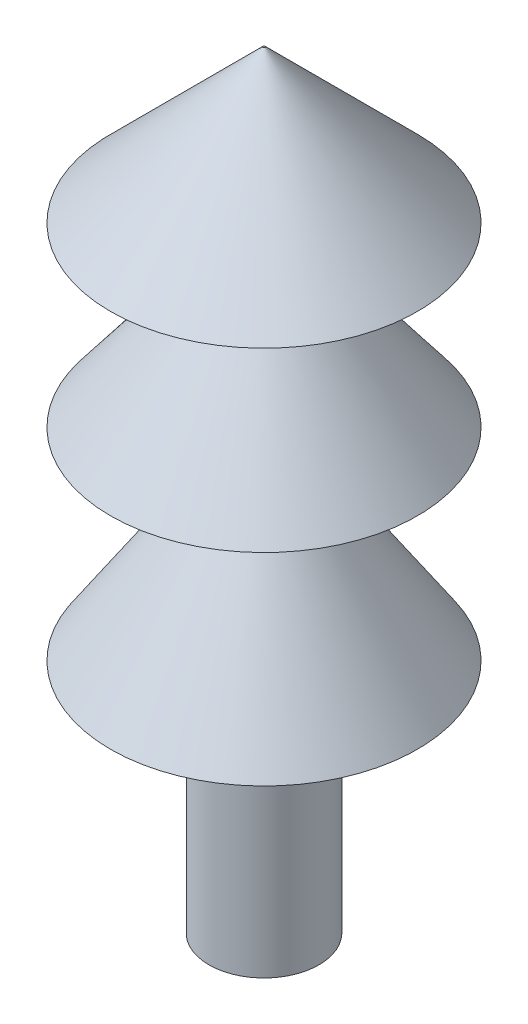
ISO-10303-21;
HEADER;
FILE_DESCRIPTION(('STEP AP214'),'2;1');
FILE_NAME('part.step','',(''),(''),'','','');
FILE_SCHEMA(('AUTOMOTIVE_DESIGN { 1 0 10303 214 1 1 1 1 }'));
ENDSEC;
DATA;
#1=APPLICATION_CONTEXT('core data for automotive mechanical design processes');
#2=APPLICATION_PROTOCOL_DEFINITION('international standard','automotive_design',2000,#1);
#3=PRODUCT_CONTEXT('',#1,'mechanical');
#4=PRODUCT('Part','Part','',(#3));
#5=PRODUCT_RELATED_PRODUCT_CATEGORY('part','',(#4));
#6=PRODUCT_DEFINITION_FORMATION('','',#4);
#7=PRODUCT_DEFINITION_CONTEXT('part definition',#1,'design');
#8=PRODUCT_DEFINITION('design','',#6,#7);
#9=PRODUCT_DEFINITION_SHAPE('','',#8);
#10=(LENGTH_UNIT() NAMED_UNIT(*) SI_UNIT(.MILLI.,.METRE.));
#11=(NAMED_UNIT(*) PLANE_ANGLE_UNIT() SI_UNIT($,.RADIAN.));
#12=(NAMED_UNIT(*) SI_UNIT($,.STERADIAN.) SOLID_ANGLE_UNIT());
#13=UNCERTAINTY_MEASURE_WITH_UNIT(LENGTH_MEASURE(1.E-05),#10,'distance_accuracy_value','');
#14=(GEOMETRIC_REPRESENTATION_CONTEXT(3) GLOBAL_UNCERTAINTY_ASSIGNED_CONTEXT((#13)) GLOBAL_UNIT_ASSIGNED_CONTEXT((#10,
#11,#12)) REPRESENTATION_CONTEXT('',''));
#15=CARTESIAN_POINT('',(0.,0.,0.));
#16=DIRECTION('',(0.,0.,1.));
#17=DIRECTION('',(1.,0.,0.));
#18=AXIS2_PLACEMENT_3D('',#15,#16,#17);
#19=CARTESIAN_POINT('',(0.,40.,0.));
#20=DIRECTION('',(0.,1.,0.));
#21=DIRECTION('',(0.,0.,1.));
#22=AXIS2_PLACEMENT_3D('',#19,#20,#21);
#23=CYLINDRICAL_SURFACE('',#22,2.86773925037495);
#24=CARTESIAN_POINT('',(0.,12.2957168686561,0.));
#25=DIRECTION('',(0.,1.,0.));
#26=DIRECTION('',(0.,0.,1.));
#27=AXIS2_PLACEMENT_3D('',#24,#25,#26);
#28=CIRCLE('',#27,2.86773925037495);
#29=CARTESIAN_POINT('',(0.,12.2957168686561,2.86773925037495));
#30=VERTEX_POINT('',#29);
#31=EDGE_CURVE('E40',#30,#30,#28,.T.);
#32=ORIENTED_EDGE('',*,*,#31,.F.);
#33=EDGE_LOOP('',(#32));
#34=FACE_BOUND('',#33,.T.);
#35=CARTESIAN_POINT('',(0.,0.,0.));
#36=DIRECTION('',(0.,1.,0.));
#37=DIRECTION('',(0.,0.,1.));
#38=AXIS2_PLACEMENT_3D('',#35,#36,#37);
#39=CIRCLE('',#38,2.86773925037495);
#40=CARTESIAN_POINT('',(0.,0.,2.86773925037495));
#41=VERTEX_POINT('',#40);
#42=EDGE_CURVE('E10',#41,#41,#39,.F.);
#43=ORIENTED_EDGE('',*,*,#42,.F.);
#44=EDGE_LOOP('',(#43));
#45=FACE_BOUND('',#44,.T.);
#46=ADVANCED_FACE('F33',(#34,#45),#23,.T.);
#47=CARTESIAN_POINT('',(0.,12.2957168686561,8.));
#48=DIRECTION('',(0.,1.,0.));
#49=DIRECTION('',(0.,0.,1.));
#50=AXIS2_PLACEMENT_3D('',#47,#48,#49);
#51=PLANE('',#50);
#52=CARTESIAN_POINT('',(0.,12.2957168686561,0.));
#53=DIRECTION('',(0.,1.,0.));
#54=DIRECTION('',(0.,0.,1.));
#55=AXIS2_PLACEMENT_3D('',#52,#53,#54);
#56=CIRCLE('',#55,8.);
#57=CARTESIAN_POINT('',(0.,12.2957168686561,-8.));
#58=VERTEX_POINT('',#57);
#59=EDGE_CURVE('E44',#58,#58,#56,.T.);
#60=ORIENTED_EDGE('',*,*,#59,.F.);
#61=EDGE_LOOP('',(#60));
#62=FACE_BOUND('',#61,.T.);
#63=ORIENTED_EDGE('',*,*,#31,.T.);
#64=EDGE_LOOP('',(#63));
#65=FACE_BOUND('',#64,.T.);
#66=ADVANCED_FACE('F95',(#62,#65),#51,.F.);
#67=CARTESIAN_POINT('',(0.,12.2957168686561,0.));
#68=DIRECTION('',(0.,-1.,0.));
#69=DIRECTION('',(0.,0.,-1.));
#70=AXIS2_PLACEMENT_3D('',#67,#68,#69);
#71=CONICAL_SURFACE('',#70,8.,0.590580734038986);
#72=CARTESIAN_POINT('',(0.,22.8328612799039,0.));
#73=DIRECTION('',(0.,1.,0.));
#74=DIRECTION('',(0.,0.,1.));
#75=AXIS2_PLACEMENT_3D('',#72,#73,#74);
#76=CIRCLE('',#75,0.93592944164618);
#77=CARTESIAN_POINT('',(0.,22.8328612799039,-0.935929441646179));
#78=VERTEX_POINT('',#77);
#79=EDGE_CURVE('E48',#78,#78,#76,.T.);
#80=CARTESIAN_POINT('',(0.,22.8328612799039,-0.935929441646179));
#81=CARTESIAN_POINT('',(0.,22.7230993589534,-1.00951350996237));
#82=CARTESIAN_POINT('',(0.,22.613337438003,-1.08309757827855));
#83=CARTESIAN_POINT('',(0.,22.3938135961019,-1.23026571491092));
#84=CARTESIAN_POINT('',(0.,22.2840516751515,-1.30384978322711));
#85=CARTESIAN_POINT('',(0.,22.0645278332505,-1.45101791985948));
#86=CARTESIAN_POINT('',(0.,21.9547659123,-1.52460198817566));
#87=CARTESIAN_POINT('',(0.,21.735242070399,-1.67177012480804));
#88=CARTESIAN_POINT('',(0.,21.6254801494485,-1.74535419312422));
#89=CARTESIAN_POINT('',(0.,21.4059563075475,-1.89252232975659));
#90=CARTESIAN_POINT('',(0.,21.296194386597,-1.96610639807278));
#91=CARTESIAN_POINT('',(0.,21.076670544696,-2.11327453470515));
#92=CARTESIAN_POINT('',(0.,20.9669086237455,-2.18685860302134));
#93=CARTESIAN_POINT('',(0.,20.7473847818445,-2.33402673965371));
#94=CARTESIAN_POINT('',(0.,20.637622860894,-2.40761080796989));
#95=CARTESIAN_POINT('',(0.,20.418099018993,-2.55477894460226));
#96=CARTESIAN_POINT('',(0.,20.3083370980425,-2.62836301291845));
#97=CARTESIAN_POINT('',(0.,20.0888132561415,-2.77553114955082));
#98=CARTESIAN_POINT('',(0.,19.979051335191,-2.84911521786701));
#99=CARTESIAN_POINT('',(0.,19.75952749329,-2.99628335449938));
#100=CARTESIAN_POINT('',(0.,19.6497655723395,-3.06986742281556));
#101=CARTESIAN_POINT('',(0.,19.4302417304385,-3.21703555944793));
#102=CARTESIAN_POINT('',(0.,19.320479809488,-3.29061962776412));
#103=CARTESIAN_POINT('',(0.,19.100955967587,-3.43778776439649));
#104=CARTESIAN_POINT('',(0.,18.9911940466365,-3.51137183271268));
#105=CARTESIAN_POINT('',(0.,18.7716702047355,-3.65853996934505));
#106=CARTESIAN_POINT('',(0.,18.661908283785,-3.73212403766123));
#107=CARTESIAN_POINT('',(0.,18.442384441884,-3.8792921742936));
#108=CARTESIAN_POINT('',(0.,18.3326225209335,-3.95287624260979));
#109=CARTESIAN_POINT('',(0.,18.1130986790325,-4.10004437924216));
#110=CARTESIAN_POINT('',(0.,18.003336758082,-4.17362844755835));
#111=CARTESIAN_POINT('',(0.,17.783812916181,-4.32079658419072));
#112=CARTESIAN_POINT('',(0.,17.6740509952305,-4.3943806525069));
#113=CARTESIAN_POINT('',(0.,17.4545271533295,-4.54154878913928));
#114=CARTESIAN_POINT('',(0.,17.344765232379,-4.61513285745546));
#115=CARTESIAN_POINT('',(0.,17.125241390478,-4.76230099408783));
#116=CARTESIAN_POINT('',(0.,17.0154794695275,-4.83588506240402));
#117=CARTESIAN_POINT('',(0.,16.7959556276265,-4.98305319903639));
#118=CARTESIAN_POINT('',(0.,16.686193706676,-5.05663726735258));
#119=CARTESIAN_POINT('',(0.,16.466669864775,-5.20380540398495));
#120=CARTESIAN_POINT('',(0.,16.3569079438245,-5.27738947230113));
#121=CARTESIAN_POINT('',(0.,16.1373841019235,-5.4245576089335));
#122=CARTESIAN_POINT('',(0.,16.027622180973,-5.49814167724969));
#123=CARTESIAN_POINT('',(0.,15.808098339072,-5.64530981388206));
#124=CARTESIAN_POINT('',(0.,15.6983364181215,-5.71889388219825));
#125=CARTESIAN_POINT('',(0.,15.4788125762205,-5.86606201883062));
#126=CARTESIAN_POINT('',(0.,15.36905065527,-5.9396460871468));
#127=CARTESIAN_POINT('',(0.,15.149526813369,-6.08681422377918));
#128=CARTESIAN_POINT('',(0.,15.0397648924185,-6.16039829209536));
#129=CARTESIAN_POINT('',(0.,14.8202410505175,-6.30756642872773));
#130=CARTESIAN_POINT('',(0.,14.710479129567,-6.38115049704392));
#131=CARTESIAN_POINT('',(0.,14.490955287666,-6.52831863367629));
#132=CARTESIAN_POINT('',(0.,14.3811933667155,-6.60190270199247));
#133=CARTESIAN_POINT('',(0.,14.1616695248145,-6.74907083862485));
#134=CARTESIAN_POINT('',(0.,14.051907603864,-6.82265490694103));
#135=CARTESIAN_POINT('',(0.,13.832383761963,-6.9698230435734));
#136=CARTESIAN_POINT('',(0.,13.7226218410125,-7.04340711188959));
#137=CARTESIAN_POINT('',(0.,13.5030979991115,-7.19057524852196));
#138=CARTESIAN_POINT('',(0.,13.393336078161,-7.26415931683814));
#139=CARTESIAN_POINT('',(0.,13.1738122362601,-7.41132745347052));
#140=CARTESIAN_POINT('',(0.,13.0640503153096,-7.4849115217867));
#141=CARTESIAN_POINT('',(0.,12.8445264734086,-7.63207965841907));
#142=CARTESIAN_POINT('',(0.,12.7347645524581,-7.70566372673526));
#143=CARTESIAN_POINT('',(0.,12.5152407105571,-7.85283186336763));
#144=CARTESIAN_POINT('',(0.,12.4054787896066,-7.92641593168382));
#145=CARTESIAN_POINT('',(0.,12.2957168686561,-8.));
#146=B_SPLINE_CURVE_WITH_KNOTS('',3,(#80,#81,#82,#83,#84,#85,#86,#87,#88,#89,#90,#91,#92,#93,
#94,#95,#96,#97,#98,#99,#100,#101,#102,#103,#104,#105,#106,#107,#108,#109,#110,#111,#112,#113,
#114,#115,#116,#117,#118,#119,#120,#121,#122,#123,#124,#125,#126,#127,#128,#129,#130,#131,#132,
#133,#134,#135,#136,#137,#138,#139,#140,#141,#142,#143,#144,#145),.UNSPECIFIED.,.F.,.F.,(4,2,2,
2,2,2,2,2,2,2,2,2,2,2,2,2,2,2,2,2,2,2,2,2,2,2,2,2,2,2,2,2,4),(0.,0.396434924806507,
0.792869849613018,1.18930477441953,1.58573969922603,1.98217462403254,2.37860954883905,
2.77504447364556,3.17147939845206,3.56791432325857,3.96434924806508,4.36078417287159,
4.7572190976781,5.1536540224846,5.55008894729111,5.94652387209762,6.34295879690413,
6.73939372171064,7.13582864651714,7.53226357132365,7.92869849613016,8.32513342093666,
8.72156834574317,9.11800327054968,9.51443819535619,9.9108731201627,10.3073080449692,
10.7037429697757,11.1001778945822,11.4966128193887,11.8930477441952,12.2894826690017,
12.6859175938083),.UNSPECIFIED.);
#147=EDGE_CURVE('BSEAM89',#78,#58,#146,.T.);
#148=ORIENTED_EDGE('',*,*,#79,.F.);
#149=ORIENTED_EDGE('',*,*,#59,.T.);
#150=ORIENTED_EDGE('',*,*,#147,.T.);
#151=ORIENTED_EDGE('',*,*,#147,.F.);
#152=EDGE_LOOP('',(#148,#150,#149,#151));
#153=FACE_BOUND('',#152,.T.);
#154=ADVANCED_FACE('F89',(#153),#71,.T.);
#155=CARTESIAN_POINT('',(0.,22.8328612799039,8.));
#156=DIRECTION('',(0.,1.,0.));
#157=DIRECTION('',(0.,0.,1.));
#158=AXIS2_PLACEMENT_3D('',#155,#156,#157);
#159=PLANE('',#158);
#160=CARTESIAN_POINT('',(0.,22.8328612799039,0.));
#161=DIRECTION('',(0.,1.,0.));
#162=DIRECTION('',(0.,0.,1.));
#163=AXIS2_PLACEMENT_3D('',#160,#161,#162);
#164=CIRCLE('',#163,8.);
#165=CARTESIAN_POINT('',(0.,22.8328612799039,-8.));
#166=VERTEX_POINT('',#165);
#167=EDGE_CURVE('E53',#166,#166,#164,.T.);
#168=ORIENTED_EDGE('',*,*,#167,.F.);
#169=EDGE_LOOP('',(#168));
#170=FACE_BOUND('',#169,.T.);
#171=ORIENTED_EDGE('',*,*,#79,.T.);
#172=EDGE_LOOP('',(#171));
#173=FACE_BOUND('',#172,.T.);
#174=ADVANCED_FACE('F83',(#170,#173),#159,.F.);
#175=CARTESIAN_POINT('',(0.,22.8328612799039,0.));
#176=DIRECTION('',(0.,-1.,0.));
#177=DIRECTION('',(0.,0.,-1.));
#178=AXIS2_PLACEMENT_3D('',#175,#176,#177);
#179=CONICAL_SURFACE('',#178,8.,0.65363730289009);
#180=CARTESIAN_POINT('',(0.,32.055370981737,0.));
#181=DIRECTION('',(0.,1.,0.));
#182=DIRECTION('',(0.,0.,1.));
#183=AXIS2_PLACEMENT_3D('',#180,#181,#182);
#184=CIRCLE('',#183,0.93592944164618);
#185=CARTESIAN_POINT('',(0.,32.055370981737,-0.935929441646182));
#186=VERTEX_POINT('',#185);
#187=EDGE_CURVE('E56',#186,#186,#184,.T.);
#188=CARTESIAN_POINT('',(0.,32.055370981737,-0.935929441646182));
#189=CARTESIAN_POINT('',(0.,31.9593031723429,-1.00951350996237));
#190=CARTESIAN_POINT('',(0.,31.8632353629488,-1.08309757827855));
#191=CARTESIAN_POINT('',(0.,31.6710997441606,-1.23026571491092));
#192=CARTESIAN_POINT('',(0.,31.5750319347665,-1.30384978322711));
#193=CARTESIAN_POINT('',(0.,31.3828963159783,-1.45101791985948));
#194=CARTESIAN_POINT('',(0.,31.2868285065842,-1.52460198817567));
#195=CARTESIAN_POINT('',(0.,31.0946928877961,-1.67177012480804));
#196=CARTESIAN_POINT('',(0.,30.998625078402,-1.74535419312422));
#197=CARTESIAN_POINT('',(0.,30.8064894596138,-1.89252232975659));
#198=CARTESIAN_POINT('',(0.,30.7104216502197,-1.96610639807278));
#199=CARTESIAN_POINT('',(0.,30.5182860314315,-2.11327453470515));
#200=CARTESIAN_POINT('',(0.,30.4222182220374,-2.18685860302134));
#201=CARTESIAN_POINT('',(0.,30.2300826032492,-2.33402673965371));
#202=CARTESIAN_POINT('',(0.,30.1340147938551,-2.40761080796989));
#203=CARTESIAN_POINT('',(0.,29.9418791750669,-2.55477894460227));
#204=CARTESIAN_POINT('',(0.,29.8458113656728,-2.62836301291845));
#205=CARTESIAN_POINT('',(0.,29.6536757468846,-2.77553114955082));
#206=CARTESIAN_POINT('',(0.,29.5576079374905,-2.84911521786701));
#207=CARTESIAN_POINT('',(0.,29.3654723187024,-2.99628335449938));
#208=CARTESIAN_POINT('',(0.,29.2694045093083,-3.06986742281556));
#209=CARTESIAN_POINT('',(0.,29.0772688905201,-3.21703555944794));
#210=CARTESIAN_POINT('',(0.,28.981201081126,-3.29061962776412));
#211=CARTESIAN_POINT('',(0.,28.7890654623378,-3.43778776439649));
#212=CARTESIAN_POINT('',(0.,28.6929976529437,-3.51137183271268));
#213=CARTESIAN_POINT('',(0.,28.5008620341555,-3.65853996934505));
#214=CARTESIAN_POINT('',(0.,28.4047942247614,-3.73212403766124));
#215=CARTESIAN_POINT('',(0.,28.2126586059732,-3.87929217429361));
#216=CARTESIAN_POINT('',(0.,28.1165907965791,-3.95287624260979));
#217=CARTESIAN_POINT('',(0.,27.9244551777909,-4.10004437924216));
#218=CARTESIAN_POINT('',(0.,27.8283873683969,-4.17362844755835));
#219=CARTESIAN_POINT('',(0.,27.6362517496087,-4.32079658419072));
#220=CARTESIAN_POINT('',(0.,27.5401839402146,-4.39438065250691));
#221=CARTESIAN_POINT('',(0.,27.3480483214264,-4.54154878913928));
#222=CARTESIAN_POINT('',(0.,27.2519805120323,-4.61513285745546));
#223=CARTESIAN_POINT('',(0.,27.0598448932441,-4.76230099408783));
#224=CARTESIAN_POINT('',(0.,26.96377708385,-4.83588506240402));
#225=CARTESIAN_POINT('',(0.,26.7716414650618,-4.98305319903639));
#226=CARTESIAN_POINT('',(0.,26.6755736556677,-5.05663726735258));
#227=CARTESIAN_POINT('',(0.,26.4834380368795,-5.20380540398495));
#228=CARTESIAN_POINT('',(0.,26.3873702274854,-5.27738947230113));
#229=CARTESIAN_POINT('',(0.,26.1952346086972,-5.4245576089335));
#230=CARTESIAN_POINT('',(0.,26.0991667993032,-5.49814167724969));
#231=CARTESIAN_POINT('',(0.,25.907031180515,-5.64530981388206));
#232=CARTESIAN_POINT('',(0.,25.8109633711209,-5.71889388219825));
#233=CARTESIAN_POINT('',(0.,25.6188277523327,-5.86606201883062));
#234=CARTESIAN_POINT('',(0.,25.5227599429386,-5.9396460871468));
#235=CARTESIAN_POINT('',(0.,25.3306243241504,-6.08681422377918));
#236=CARTESIAN_POINT('',(0.,25.2345565147563,-6.16039829209536));
#237=CARTESIAN_POINT('',(0.,25.0424208959681,-6.30756642872773));
#238=CARTESIAN_POINT('',(0.,24.946353086574,-6.38115049704392));
#239=CARTESIAN_POINT('',(0.,24.7542174677858,-6.52831863367629));
#240=CARTESIAN_POINT('',(0.,24.6581496583917,-6.60190270199247));
#241=CARTESIAN_POINT('',(0.,24.4660140396035,-6.74907083862485));
#242=CARTESIAN_POINT('',(0.,24.3699462302095,-6.82265490694103));
#243=CARTESIAN_POINT('',(0.,24.1778106114213,-6.9698230435734));
#244=CARTESIAN_POINT('',(0.,24.0817428020272,-7.04340711188959));
#245=CARTESIAN_POINT('',(0.,23.889607183239,-7.19057524852196));
#246=CARTESIAN_POINT('',(0.,23.7935393738449,-7.26415931683815));
#247=CARTESIAN_POINT('',(0.,23.6014037550567,-7.41132745347052));
#248=CARTESIAN_POINT('',(0.,23.5053359456626,-7.4849115217867));
#249=CARTESIAN_POINT('',(0.,23.3132003268744,-7.63207965841907));
#250=CARTESIAN_POINT('',(0.,23.2171325174803,-7.70566372673526));
#251=CARTESIAN_POINT('',(0.,23.0249968986921,-7.85283186336763));
#252=CARTESIAN_POINT('',(0.,22.928929089298,-7.92641593168382));
#253=CARTESIAN_POINT('',(0.,22.8328612799039,-8.));
#254=B_SPLINE_CURVE_WITH_KNOTS('',3,(#188,#189,#190,#191,#192,#193,#194,#195,#196,#197,#198,
#199,#200,#201,#202,#203,#204,#205,#206,#207,#208,#209,#210,#211,#212,#213,#214,#215,#216,#217,
#218,#219,#220,#221,#222,#223,#224,#225,#226,#227,#228,#229,#230,#231,#232,#233,#234,#235,#236,
#237,#238,#239,#240,#241,#242,#243,#244,#245,#246,#247,#248,#249,#250,#251,#252,#253),
.UNSPECIFIED.,.F.,.F.,(4,2,2,2,2,2,2,2,2,2,2,2,2,2,2,2,2,2,2,2,2,2,2,2,2,2,2,2,2,2,2,2,4),(0.,
0.363032714787069,0.726065429574138,1.08909814436121,1.45213085914828,1.81516357393535,
2.17819628872241,2.54122900350949,2.90426171829656,3.26729443308363,3.6303271478707,
3.99335986265777,4.35639257744483,4.7194252922319,5.08245800701898,5.44549072180604,
5.80852343659311,6.17155615138019,6.53458886616725,6.89762158095432,7.26065429574139,
7.62368701052846,7.98671972531553,8.3497524401026,8.71278515488968,9.07581786967675,
9.43885058446381,9.80188329925088,10.164916014038,10.527948728825,10.8909814436121,
11.2540141583992,11.6170468731862),.UNSPECIFIED.);
#255=EDGE_CURVE('BSEAM77',#186,#166,#254,.T.);
#256=ORIENTED_EDGE('',*,*,#187,.F.);
#257=ORIENTED_EDGE('',*,*,#167,.T.);
#258=ORIENTED_EDGE('',*,*,#255,.T.);
#259=ORIENTED_EDGE('',*,*,#255,.F.);
#260=EDGE_LOOP('',(#256,#258,#257,#259));
#261=FACE_BOUND('',#260,.T.);
#262=ADVANCED_FACE('F77',(#261),#179,.T.);
#263=CARTESIAN_POINT('',(0.,32.055370981737,8.));
#264=DIRECTION('',(0.,1.,0.));
#265=DIRECTION('',(0.,0.,1.));
#266=AXIS2_PLACEMENT_3D('',#263,#264,#265);
#267=PLANE('',#266);
#268=CARTESIAN_POINT('',(0.,32.055370981737,0.));
#269=DIRECTION('',(0.,1.,0.));
#270=DIRECTION('',(0.,0.,1.));
#271=AXIS2_PLACEMENT_3D('',#268,#269,#270);
#272=CIRCLE('',#271,8.);
#273=CARTESIAN_POINT('',(0.,32.055370981737,-8.));
#274=VERTEX_POINT('',#273);
#275=EDGE_CURVE('E59',#274,#274,#272,.T.);
#276=ORIENTED_EDGE('',*,*,#275,.F.);
#277=EDGE_LOOP('',(#276));
#278=FACE_BOUND('',#277,.T.);
#279=ORIENTED_EDGE('',*,*,#187,.T.);
#280=EDGE_LOOP('',(#279));
#281=FACE_BOUND('',#280,.T.);
#282=ADVANCED_FACE('F71',(#278,#281),#267,.F.);
#283=CARTESIAN_POINT('',(0.,32.055370981737,0.));
#284=DIRECTION('',(0.,-1.,0.));
#285=DIRECTION('',(0.,0.,-1.));
#286=AXIS2_PLACEMENT_3D('',#283,#284,#285);
#287=CONICAL_SURFACE('',#286,8.,0.78539816339744);
#288=CARTESIAN_POINT('',(0.,40.,0.));
#289=DIRECTION('',(0.,1.,0.));
#290=DIRECTION('',(0.,0.,1.));
#291=AXIS2_PLACEMENT_3D('',#288,#289,#290);
#292=CIRCLE('',#291,0.0553709817371403);
#293=CARTESIAN_POINT('',(0.,40.,-0.055370981737142));
#294=VERTEX_POINT('',#293);
#295=EDGE_CURVE('E62',#294,#294,#292,.T.);
#296=CARTESIAN_POINT('',(0.,40.,-0.055370981737142));
#297=CARTESIAN_POINT('',(0.,39.9172434477264,-0.138127534010714));
#298=CARTESIAN_POINT('',(0.,39.8344868954528,-0.220884086284285));
#299=CARTESIAN_POINT('',(0.,39.6689737909057,-0.386397190831428));
#300=CARTESIAN_POINT('',(0.,39.5862172386321,-0.469153743105));
#301=CARTESIAN_POINT('',(0.,39.420704134085,-0.634666847652143));
#302=CARTESIAN_POINT('',(0.,39.3379475818114,-0.717423399925715));
#303=CARTESIAN_POINT('',(0.,39.1724344772643,-0.882936504472858));
#304=CARTESIAN_POINT('',(0.,39.0896779249907,-0.965693056746429));
#305=CARTESIAN_POINT('',(0.,38.9241648204436,-1.13120616129357));
#306=CARTESIAN_POINT('',(0.,38.84140826817,-1.21396271356714));
#307=CARTESIAN_POINT('',(0.,38.6758951636228,-1.37947581811429));
#308=CARTESIAN_POINT('',(0.,38.5931386113493,-1.46223237038786));
#309=CARTESIAN_POINT('',(0.,38.4276255068021,-1.627745474935));
#310=CARTESIAN_POINT('',(0.,38.3448689545285,-1.71050202720857));
#311=CARTESIAN_POINT('',(0.,38.1793558499814,-1.87601513175571));
#312=CARTESIAN_POINT('',(0.,38.0965992977078,-1.95877168402929));
#313=CARTESIAN_POINT('',(0.,37.9310861931607,-2.12428478857643));
#314=CARTESIAN_POINT('',(0.,37.8483296408871,-2.20704134085));
#315=CARTESIAN_POINT('',(0.,37.68281653634,-2.37255444539714));
#316=CARTESIAN_POINT('',(0.,37.6000599840664,-2.45531099767072));
#317=CARTESIAN_POINT('',(0.,37.4345468795192,-2.62082410221786));
#318=CARTESIAN_POINT('',(0.,37.3517903272457,-2.70358065449143));
#319=CARTESIAN_POINT('',(0.,37.1862772226985,-2.86909375903857));
#320=CARTESIAN_POINT('',(0.,37.1035206704249,-2.95185031131214));
#321=CARTESIAN_POINT('',(0.,36.9380075658778,-3.11736341585929));
#322=CARTESIAN_POINT('',(0.,36.8552510136042,-3.20011996813286));
#323=CARTESIAN_POINT('',(0.,36.6897379090571,-3.36563307268));
#324=CARTESIAN_POINT('',(0.,36.6069813567835,-3.44838962495357));
#325=CARTESIAN_POINT('',(0.,36.4414682522364,-3.61390272950072));
#326=CARTESIAN_POINT('',(0.,36.3587116999628,-3.69665928177429));
#327=CARTESIAN_POINT('',(0.,36.1931985954157,-3.86217238632143));
#328=CARTESIAN_POINT('',(0.,36.1104420431421,-3.944928938595));
#329=CARTESIAN_POINT('',(0.,35.9449289385949,-4.11044204314214));
#330=CARTESIAN_POINT('',(0.,35.8621723863214,-4.19319859541572));
#331=CARTESIAN_POINT('',(0.,35.6966592817742,-4.35871169996286));
#332=CARTESIAN_POINT('',(0.,35.6139027295006,-4.44146825223643));
#333=CARTESIAN_POINT('',(0.,35.4483896249535,-4.60698135678357));
#334=CARTESIAN_POINT('',(0.,35.3656330726799,-4.68973790905715));
#335=CARTESIAN_POINT('',(0.,35.2001199681328,-4.85525101360429));
#336=CARTESIAN_POINT('',(0.,35.1173634158592,-4.93800756587786));
#337=CARTESIAN_POINT('',(0.,34.9518503113121,-5.103520670425));
#338=CARTESIAN_POINT('',(0.,34.8690937590385,-5.18627722269857));
#339=CARTESIAN_POINT('',(0.,34.7035806544913,-5.35179032724572));
#340=CARTESIAN_POINT('',(0.,34.6208241022178,-5.43454687951929));
#341=CARTESIAN_POINT('',(0.,34.4553109976706,-5.60005998406643));
#342=CARTESIAN_POINT('',(0.,34.372554445397,-5.68281653634));
#343=CARTESIAN_POINT('',(0.,34.2070413408499,-5.84832964088715));
#344=CARTESIAN_POINT('',(0.,34.1242847885763,-5.93108619316072));
#345=CARTESIAN_POINT('',(0.,33.9587716840292,-6.09659929770786));
#346=CARTESIAN_POINT('',(0.,33.8760151317556,-6.17935584998143));
#347=CARTESIAN_POINT('',(0.,33.7105020272085,-6.34486895452857));
#348=CARTESIAN_POINT('',(0.,33.6277454749349,-6.42762550680215));
#349=CARTESIAN_POINT('',(0.,33.4622323703877,-6.59313861134929));
#350=CARTESIAN_POINT('',(0.,33.3794758181142,-6.67589516362286));
#351=CARTESIAN_POINT('',(0.,33.213962713567,-6.84140826817));
#352=CARTESIAN_POINT('',(0.,33.1312061612934,-6.92416482044358));
#353=CARTESIAN_POINT('',(0.,32.9656930567463,-7.08967792499072));
#354=CARTESIAN_POINT('',(0.,32.8829365044727,-7.17243447726429));
#355=CARTESIAN_POINT('',(0.,32.7174233999256,-7.33794758181143));
#356=CARTESIAN_POINT('',(0.,32.634666847652,-7.420704134085));
#357=CARTESIAN_POINT('',(0.,32.4691537431049,-7.58621723863215));
#358=CARTESIAN_POINT('',(0.,32.3863971908313,-7.66897379090572));
#359=CARTESIAN_POINT('',(0.,32.2208840862841,-7.83448689545286));
#360=CARTESIAN_POINT('',(0.,32.1381275340106,-7.91724344772643));
#361=CARTESIAN_POINT('',(0.,32.055370981737,-8.));
#362=B_SPLINE_CURVE_WITH_KNOTS('',3,(#296,#297,#298,#299,#300,#301,#302,#303,#304,#305,#306,
#307,#308,#309,#310,#311,#312,#313,#314,#315,#316,#317,#318,#319,#320,#321,#322,#323,#324,#325,
#326,#327,#328,#329,#330,#331,#332,#333,#334,#335,#336,#337,#338,#339,#340,#341,#342,#343,#344,
#345,#346,#347,#348,#349,#350,#351,#352,#353,#354,#355,#356,#357,#358,#359,#360,#361),
.UNSPECIFIED.,.F.,.F.,(4,2,2,2,2,2,2,2,2,2,2,2,2,2,2,2,2,2,2,2,2,2,2,2,2,2,2,2,2,2,2,2,4),(0.,
0.351106315801571,0.702212631603142,1.05331894740471,1.40442526320628,1.75553157900785,
2.10663789480943,2.457744210611,2.80885052641257,3.15995684221414,3.51106315801571,
3.86216947381728,4.21327578961885,4.56438210542042,4.91548842122199,5.26659473702357,
5.61770105282514,5.96880736862671,6.31991368442828,6.67102000022985,7.02212631603142,
7.373232631833,7.72433894763457,8.07544526343614,8.42655157923771,8.77765789503928,
9.12876421084085,9.47987052664242,9.83097684244399,10.1820831582456,10.5331894740471,
10.8842957898487,11.2354021056503),.UNSPECIFIED.);
#363=EDGE_CURVE('BSEAM68',#294,#274,#362,.T.);
#364=ORIENTED_EDGE('',*,*,#295,.F.);
#365=ORIENTED_EDGE('',*,*,#275,.T.);
#366=ORIENTED_EDGE('',*,*,#363,.T.);
#367=ORIENTED_EDGE('',*,*,#363,.F.);
#368=EDGE_LOOP('',(#364,#366,#365,#367));
#369=FACE_BOUND('',#368,.T.);
#370=ADVANCED_FACE('F68',(#369),#287,.T.);
#371=CARTESIAN_POINT('',(0.,0.,0.));
#372=DIRECTION('',(0.,1.,0.));
#373=DIRECTION('',(0.,0.,1.));
#374=AXIS2_PLACEMENT_3D('',#371,#372,#373);
#375=PLANE('',#374);
#376=ORIENTED_EDGE('',*,*,#42,.T.);
#377=EDGE_LOOP('',(#376));
#378=FACE_BOUND('',#377,.T.);
#379=ADVANCED_FACE('F35',(#378),#375,.F.);
#380=CARTESIAN_POINT('',(0.,40.,0.));
#381=DIRECTION('',(0.,1.,0.));
#382=DIRECTION('',(0.,0.,1.));
#383=AXIS2_PLACEMENT_3D('',#380,#381,#382);
#384=PLANE('',#383);
#385=ORIENTED_EDGE('',*,*,#295,.T.);
#386=EDGE_LOOP('',(#385));
#387=FACE_BOUND('',#386,.T.);
#388=ADVANCED_FACE('F66',(#387),#384,.T.);
#389=CLOSED_SHELL('',(#46,#66,#154,#174,#262,#282,#370,#379,#388));
#390=MANIFOLD_SOLID_BREP('B2',#389);
#391=ADVANCED_BREP_SHAPE_REPRESENTATION('',(#18,#390),#14);
#392=SHAPE_DEFINITION_REPRESENTATION(#9,#391);
ENDSEC;
END-ISO-10303-21;
